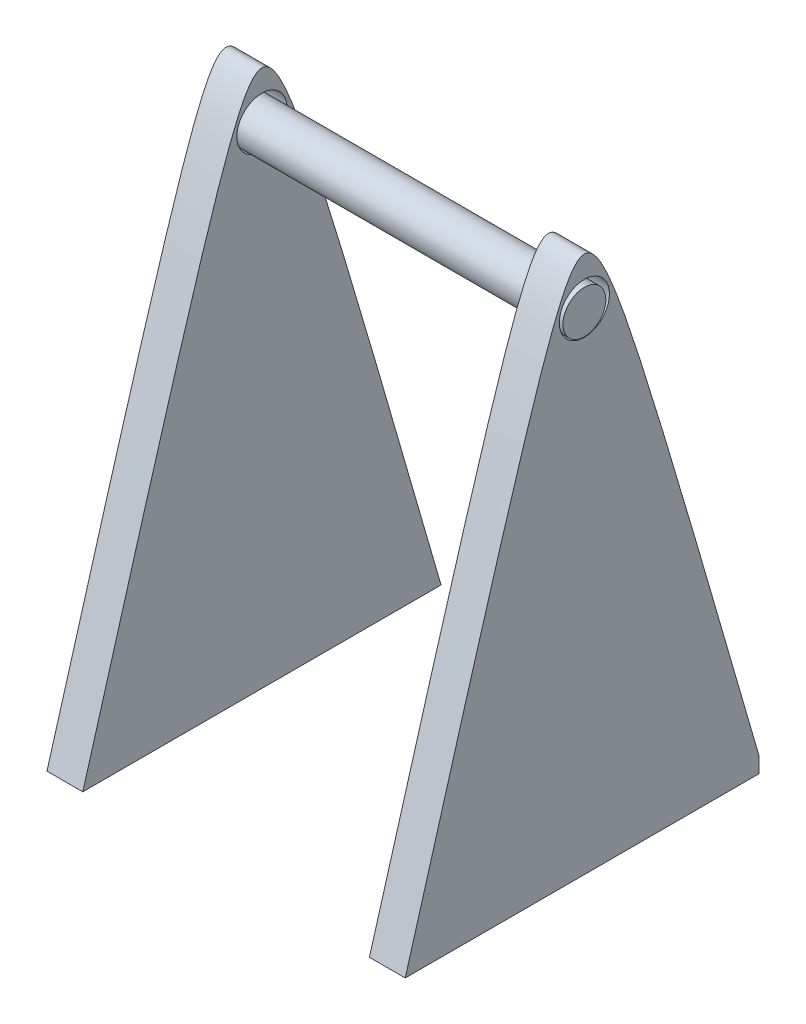
ISO-10303-21;
HEADER;
FILE_DESCRIPTION(('STEP AP214'),'2;1');
FILE_NAME('part.step','',(''),(''),'','','');
FILE_SCHEMA(('AUTOMOTIVE_DESIGN { 1 0 10303 214 1 1 1 1 }'));
ENDSEC;
DATA;
#1=APPLICATION_CONTEXT('core data for automotive mechanical design processes');
#2=APPLICATION_PROTOCOL_DEFINITION('international standard','automotive_design',2000,#1);
#3=PRODUCT_CONTEXT('',#1,'mechanical');
#4=PRODUCT('Part','Part','',(#3));
#5=PRODUCT_RELATED_PRODUCT_CATEGORY('part','',(#4));
#6=PRODUCT_DEFINITION_FORMATION('','',#4);
#7=PRODUCT_DEFINITION_CONTEXT('part definition',#1,'design');
#8=PRODUCT_DEFINITION('design','',#6,#7);
#9=PRODUCT_DEFINITION_SHAPE('','',#8);
#10=(LENGTH_UNIT() NAMED_UNIT(*) SI_UNIT(.MILLI.,.METRE.));
#11=(NAMED_UNIT(*) PLANE_ANGLE_UNIT() SI_UNIT($,.RADIAN.));
#12=(NAMED_UNIT(*) SI_UNIT($,.STERADIAN.) SOLID_ANGLE_UNIT());
#13=UNCERTAINTY_MEASURE_WITH_UNIT(LENGTH_MEASURE(1.E-05),#10,'distance_accuracy_value','');
#14=(GEOMETRIC_REPRESENTATION_CONTEXT(3) GLOBAL_UNCERTAINTY_ASSIGNED_CONTEXT((#13)) GLOBAL_UNIT_ASSIGNED_CONTEXT((#10,
#11,#12)) REPRESENTATION_CONTEXT('',''));
#15=CARTESIAN_POINT('',(0.,0.,0.));
#16=DIRECTION('',(0.,0.,1.));
#17=DIRECTION('',(1.,0.,0.));
#18=AXIS2_PLACEMENT_3D('',#15,#16,#17);
#19=CARTESIAN_POINT('',(-1286.24708052431,135.992086984383,-20.7594628975972));
#20=DIRECTION('',(-1.,0.,0.));
#21=DIRECTION('',(0.,0.,1.));
#22=AXIS2_PLACEMENT_3D('',#19,#20,#21);
#23=CYLINDRICAL_SURFACE('',#22,5.98376235501393);
#24=CARTESIAN_POINT('',(-1286.24708052431,135.992086984383,-20.7594628975972));
#25=DIRECTION('',(-1.,0.,0.));
#26=DIRECTION('',(0.,0.,1.));
#27=AXIS2_PLACEMENT_3D('',#24,#25,#26);
#28=CIRCLE('',#27,5.98376235501393);
#29=CARTESIAN_POINT('',(-1286.24708052431,135.992086984383,-14.7757005425833));
#30=VERTEX_POINT('',#29);
#31=EDGE_CURVE('E11',#30,#30,#28,.T.);
#32=ORIENTED_EDGE('',*,*,#31,.T.);
#33=EDGE_LOOP('',(#32));
#34=FACE_BOUND('',#33,.T.);
#35=CARTESIAN_POINT('',(-1386.24708052431,135.992086984383,-20.7594628975972));
#36=DIRECTION('',(-1.,0.,0.));
#37=DIRECTION('',(0.,0.,1.));
#38=AXIS2_PLACEMENT_3D('',#35,#36,#37);
#39=CIRCLE('',#38,5.98376235501393);
#40=CARTESIAN_POINT('',(-1386.24708052431,135.992086984383,-14.7757005425833));
#41=VERTEX_POINT('',#40);
#42=EDGE_CURVE('E44',#41,#41,#39,.T.);
#43=ORIENTED_EDGE('',*,*,#42,.F.);
#44=EDGE_LOOP('',(#43));
#45=FACE_BOUND('',#44,.T.);
#46=ADVANCED_FACE('F41',(#34,#45),#23,.T.);
#47=CARTESIAN_POINT('',(-1286.24708052431,135.992086984383,-20.7594628975972));
#48=DIRECTION('',(-1.,0.,0.));
#49=DIRECTION('',(0.,0.,1.));
#50=AXIS2_PLACEMENT_3D('',#47,#48,#49);
#51=PLANE('',#50);
#52=ORIENTED_EDGE('',*,*,#31,.F.);
#53=EDGE_LOOP('',(#52));
#54=FACE_BOUND('',#53,.T.);
#55=ADVANCED_FACE('F56',(#54),#51,.F.);
#56=CARTESIAN_POINT('',(-1386.24708052431,135.992086984383,-20.7594628975972));
#57=DIRECTION('',(-1.,0.,0.));
#58=DIRECTION('',(0.,0.,1.));
#59=AXIS2_PLACEMENT_3D('',#56,#57,#58);
#60=PLANE('',#59);
#61=ORIENTED_EDGE('',*,*,#42,.T.);
#62=EDGE_LOOP('',(#61));
#63=FACE_BOUND('',#62,.T.);
#64=ADVANCED_FACE('F53',(#63),#60,.T.);
#65=CLOSED_SHELL('',(#46,#55,#64));
#66=MANIFOLD_SOLID_BREP('B2',#65);
#67=CARTESIAN_POINT('',(-1769.70016923585,0.,-70.7594628975371));
#68=CARTESIAN_POINT('',(-1769.70016923585,173.888898661798,-20.7594628975372));
#69=CARTESIAN_POINT('',(-1769.70016923585,0.,29.2405371024629));
#70=(BOUNDED_CURVE() B_SPLINE_CURVE(2,(#67,#68,#69),.UNSPECIFIED.,.F.,
.F.) B_SPLINE_CURVE_WITH_KNOTS((3,3),(0.,1.),
.UNSPECIFIED.) CURVE() GEOMETRIC_REPRESENTATION_ITEM() RATIONAL_B_SPLINE_CURVE((1.,
6.27906719868464,1.)) REPRESENTATION_ITEM(''));
#71=DIRECTION('',(1.,0.,0.));
#72=VECTOR('',#71,1.);
#73=SURFACE_OF_LINEAR_EXTRUSION('',#70,#72);
#74=DIRECTION('',(1.,0.,0.));
#75=VECTOR('',#74,1.);
#76=CARTESIAN_POINT('',(-1769.70016923585,0.,29.2405371024629));
#77=LINE('',#76,#75);
#78=CARTESIAN_POINT('',(-1296.24708052431,0.,29.2405371024629));
#79=VERTEX_POINT('',#78);
#80=CARTESIAN_POINT('',(-1286.24708052431,0.,29.2405371024629));
#81=VERTEX_POINT('',#80);
#82=EDGE_CURVE('E39',#79,#81,#77,.T.);
#83=ORIENTED_EDGE('',*,*,#82,.T.);
#84=CARTESIAN_POINT('',(-1286.24708052431,0.,-70.7594628975371));
#85=CARTESIAN_POINT('',(-1286.24708052431,173.888898661798,-20.7594628975372));
#86=CARTESIAN_POINT('',(-1286.24708052431,0.,29.2405371024629));
#87=(BOUNDED_CURVE() B_SPLINE_CURVE(2,(#84,#85,#86),.UNSPECIFIED.,.F.,
.F.) B_SPLINE_CURVE_WITH_KNOTS((3,3),(0.,1.),
.UNSPECIFIED.) CURVE() GEOMETRIC_REPRESENTATION_ITEM() RATIONAL_B_SPLINE_CURVE((1.,
6.27906719868464,1.)) REPRESENTATION_ITEM(''));
#88=CARTESIAN_POINT('',(-1286.24708052431,4.33133944762662,-69.5136264334978));
#89=VERTEX_POINT('',#88);
#90=EDGE_CURVE('E105',#81,#89,#87,.F.);
#91=ORIENTED_EDGE('',*,*,#90,.T.);
#92=DIRECTION('',(1.,0.,0.));
#93=VECTOR('',#92,1.);
#94=CARTESIAN_POINT('',(-1769.70016923585,4.33133944762662,-69.5136264334978));
#95=LINE('',#94,#93);
#96=CARTESIAN_POINT('',(-1296.24708052431,4.33133944762673,-69.5136264334978));
#97=VERTEX_POINT('',#96);
#98=EDGE_CURVE('E136',#89,#97,#95,.F.);
#99=ORIENTED_EDGE('',*,*,#98,.T.);
#100=CARTESIAN_POINT('',(-1296.24708052431,0.,-70.7594628975371));
#101=CARTESIAN_POINT('',(-1296.24708052431,173.888898661798,-20.7594628975372));
#102=CARTESIAN_POINT('',(-1296.24708052431,0.,29.2405371024629));
#103=(BOUNDED_CURVE() B_SPLINE_CURVE(2,(#100,#101,#102),.UNSPECIFIED.,.F.,
.F.) B_SPLINE_CURVE_WITH_KNOTS((3,3),(0.,1.),
.UNSPECIFIED.) CURVE() GEOMETRIC_REPRESENTATION_ITEM() RATIONAL_B_SPLINE_CURVE((1.,
6.27906719868464,1.)) REPRESENTATION_ITEM(''));
#104=EDGE_CURVE('E113',#97,#79,#103,.T.);
#105=ORIENTED_EDGE('',*,*,#104,.T.);
#106=EDGE_LOOP('',(#83,#91,#99,#105));
#107=FACE_BOUND('',#106,.T.);
#108=ADVANCED_FACE('F90',(#107),#73,.T.);
#109=CARTESIAN_POINT('',(-1286.24708052431,150.,-69.5136264334978));
#110=DIRECTION('',(-1.,0.,0.));
#111=DIRECTION('',(0.,0.,1.));
#112=AXIS2_PLACEMENT_3D('',#109,#110,#111);
#113=PLANE('',#112);
#114=CARTESIAN_POINT('',(-1286.24708052431,136.874782273766,-20.7594628975972));
#115=DIRECTION('',(-1.,0.,0.));
#116=DIRECTION('',(0.,0.,1.));
#117=AXIS2_PLACEMENT_3D('',#114,#115,#116);
#118=CIRCLE('',#117,7.00000000000001);
#119=CARTESIAN_POINT('',(-1286.24708052431,136.874782273766,-13.7594628975972));
#120=VERTEX_POINT('',#119);
#121=EDGE_CURVE('E141',#120,#120,#118,.T.);
#122=ORIENTED_EDGE('',*,*,#121,.T.);
#123=EDGE_LOOP('',(#122));
#124=FACE_BOUND('',#123,.T.);
#125=ORIENTED_EDGE('',*,*,#90,.F.);
#126=DIRECTION('',(0.,0.,-1.));
#127=VECTOR('',#126,1.);
#128=CARTESIAN_POINT('',(-1286.24708052431,0.,-69.5136264334978));
#129=LINE('',#128,#127);
#130=CARTESIAN_POINT('',(-1286.24708052431,0.,-69.5136264334978));
#131=VERTEX_POINT('',#130);
#132=EDGE_CURVE('E128',#81,#131,#129,.T.);
#133=ORIENTED_EDGE('',*,*,#132,.T.);
#134=DIRECTION('',(0.,-1.,0.));
#135=VECTOR('',#134,1.);
#136=CARTESIAN_POINT('',(-1286.24708052431,150.,-69.5136264334978));
#137=LINE('',#136,#135);
#138=EDGE_CURVE('E99',#89,#131,#137,.T.);
#139=ORIENTED_EDGE('',*,*,#138,.F.);
#140=EDGE_LOOP('',(#125,#133,#139));
#141=FACE_BOUND('',#140,.T.);
#142=ADVANCED_FACE('F92',(#124,#141),#113,.F.);
#143=CARTESIAN_POINT('',(-1296.24708052431,150.,-69.5136264334978));
#144=DIRECTION('',(0.,0.,1.));
#145=DIRECTION('',(1.,0.,0.));
#146=AXIS2_PLACEMENT_3D('',#143,#144,#145);
#147=PLANE('',#146);
#148=ORIENTED_EDGE('',*,*,#98,.F.);
#149=ORIENTED_EDGE('',*,*,#138,.T.);
#150=DIRECTION('',(-1.,0.,0.));
#151=VECTOR('',#150,1.);
#152=CARTESIAN_POINT('',(-1296.24708052431,0.,-69.5136264334978));
#153=LINE('',#152,#151);
#154=CARTESIAN_POINT('',(-1296.24708052431,0.,-69.5136264334978));
#155=VERTEX_POINT('',#154);
#156=EDGE_CURVE('E132',#131,#155,#153,.T.);
#157=ORIENTED_EDGE('',*,*,#156,.T.);
#158=DIRECTION('',(0.,-1.,0.));
#159=VECTOR('',#158,1.);
#160=CARTESIAN_POINT('',(-1296.24708052431,150.,-69.5136264334978));
#161=LINE('',#160,#159);
#162=EDGE_CURVE('E161',#97,#155,#161,.T.);
#163=ORIENTED_EDGE('',*,*,#162,.F.);
#164=EDGE_LOOP('',(#148,#149,#157,#163));
#165=FACE_BOUND('',#164,.T.);
#166=ADVANCED_FACE('F164',(#165),#147,.F.);
#167=CARTESIAN_POINT('',(-1296.24708052431,150.,-69.5136264334978));
#168=DIRECTION('',(1.,0.,0.));
#169=DIRECTION('',(0.,0.,-1.));
#170=AXIS2_PLACEMENT_3D('',#167,#168,#169);
#171=PLANE('',#170);
#172=CARTESIAN_POINT('',(-1296.24708052431,136.874782273766,-20.7594628975972));
#173=DIRECTION('',(1.,0.,0.));
#174=DIRECTION('',(0.,0.,-1.));
#175=AXIS2_PLACEMENT_3D('',#172,#173,#174);
#176=CIRCLE('',#175,7.00000000000001);
#177=CARTESIAN_POINT('',(-1296.24708052431,136.874782273766,-27.7594628975972));
#178=VERTEX_POINT('',#177);
#179=EDGE_CURVE('E94',#178,#178,#176,.T.);
#180=ORIENTED_EDGE('',*,*,#179,.T.);
#181=EDGE_LOOP('',(#180));
#182=FACE_BOUND('',#181,.T.);
#183=ORIENTED_EDGE('',*,*,#104,.F.);
#184=ORIENTED_EDGE('',*,*,#162,.T.);
#185=DIRECTION('',(0.,0.,1.));
#186=VECTOR('',#185,1.);
#187=CARTESIAN_POINT('',(-1296.24708052431,0.,-69.5136264334978));
#188=LINE('',#187,#186);
#189=EDGE_CURVE('E159',#155,#79,#188,.T.);
#190=ORIENTED_EDGE('',*,*,#189,.T.);
#191=EDGE_LOOP('',(#183,#184,#190));
#192=FACE_BOUND('',#191,.T.);
#193=ADVANCED_FACE('F165',(#182,#192),#171,.F.);
#194=CARTESIAN_POINT('',(0.,0.,0.));
#195=DIRECTION('',(0.,1.,0.));
#196=DIRECTION('',(0.,0.,1.));
#197=AXIS2_PLACEMENT_3D('',#194,#195,#196);
#198=PLANE('',#197);
#199=ORIENTED_EDGE('',*,*,#82,.F.);
#200=ORIENTED_EDGE('',*,*,#189,.F.);
#201=ORIENTED_EDGE('',*,*,#156,.F.);
#202=ORIENTED_EDGE('',*,*,#132,.F.);
#203=EDGE_LOOP('',(#199,#200,#201,#202));
#204=FACE_BOUND('',#203,.T.);
#205=ADVANCED_FACE('F129',(#204),#198,.F.);
#206=CARTESIAN_POINT('',(-1286.24708052431,136.874782273766,-20.7594628975972));
#207=DIRECTION('',(-1.,0.,0.));
#208=DIRECTION('',(0.,0.,1.));
#209=AXIS2_PLACEMENT_3D('',#206,#207,#208);
#210=CYLINDRICAL_SURFACE('',#209,7.00000000000001);
#211=ORIENTED_EDGE('',*,*,#121,.F.);
#212=EDGE_LOOP('',(#211));
#213=FACE_BOUND('',#212,.T.);
#214=ORIENTED_EDGE('',*,*,#179,.F.);
#215=EDGE_LOOP('',(#214));
#216=FACE_BOUND('',#215,.T.);
#217=ADVANCED_FACE('F173',(#213,#216),#210,.F.);
#218=CLOSED_SHELL('',(#108,#142,#166,#193,#205,#217));
#219=MANIFOLD_SOLID_BREP('B6',#218);
#220=CARTESIAN_POINT('',(-1769.70016923585,0.,-70.7594628975371));
#221=CARTESIAN_POINT('',(-1769.70016923585,173.888898661798,-20.7594628975372));
#222=CARTESIAN_POINT('',(-1769.70016923585,0.,29.2405371024629));
#223=(BOUNDED_CURVE() B_SPLINE_CURVE(2,(#220,#221,#222),.UNSPECIFIED.,.F.,
.F.) B_SPLINE_CURVE_WITH_KNOTS((3,3),(0.,1.),
.UNSPECIFIED.) CURVE() GEOMETRIC_REPRESENTATION_ITEM() RATIONAL_B_SPLINE_CURVE((1.,
6.27906719868464,1.)) REPRESENTATION_ITEM(''));
#224=DIRECTION('',(1.,0.,0.));
#225=VECTOR('',#224,1.);
#226=SURFACE_OF_LINEAR_EXTRUSION('',#223,#225);
#227=DIRECTION('',(1.,0.,0.));
#228=VECTOR('',#227,1.);
#229=CARTESIAN_POINT('',(-1386.24708052431,0.,29.2405371024629));
#230=LINE('',#229,#228);
#231=CARTESIAN_POINT('',(-1386.24708052431,0.,29.2405371024629));
#232=VERTEX_POINT('',#231);
#233=CARTESIAN_POINT('',(-1376.24708052431,0.,29.2405371024629));
#234=VERTEX_POINT('',#233);
#235=EDGE_CURVE('E88',#232,#234,#230,.T.);
#236=ORIENTED_EDGE('',*,*,#235,.T.);
#237=CARTESIAN_POINT('',(-1376.24708052431,0.,-70.7594628975371));
#238=CARTESIAN_POINT('',(-1376.24708052431,173.888898661798,-20.7594628975372));
#239=CARTESIAN_POINT('',(-1376.24708052431,0.,29.2405371024629));
#240=(BOUNDED_CURVE() B_SPLINE_CURVE(2,(#237,#238,#239),.UNSPECIFIED.,.F.,
.F.) B_SPLINE_CURVE_WITH_KNOTS((3,3),(0.,1.),
.UNSPECIFIED.) CURVE() GEOMETRIC_REPRESENTATION_ITEM() RATIONAL_B_SPLINE_CURVE((1.,
6.27906719868464,1.)) REPRESENTATION_ITEM(''));
#241=CARTESIAN_POINT('',(-1376.24708052431,0.,-70.7594628975371));
#242=VERTEX_POINT('',#241);
#243=EDGE_CURVE('E257',#234,#242,#240,.F.);
#244=ORIENTED_EDGE('',*,*,#243,.T.);
#245=DIRECTION('',(-1.,0.,0.));
#246=VECTOR('',#245,1.);
#247=CARTESIAN_POINT('',(-1386.24708052431,0.,-70.7594628975371));
#248=LINE('',#247,#246);
#249=CARTESIAN_POINT('',(-1386.24708052431,0.,-70.7594628975371));
#250=VERTEX_POINT('',#249);
#251=EDGE_CURVE('E255',#242,#250,#248,.T.);
#252=ORIENTED_EDGE('',*,*,#251,.T.);
#253=CARTESIAN_POINT('',(-1386.24708052431,0.,-70.7594628975371));
#254=CARTESIAN_POINT('',(-1386.24708052431,173.888898661798,-20.7594628975372));
#255=CARTESIAN_POINT('',(-1386.24708052431,0.,29.2405371024629));
#256=(BOUNDED_CURVE() B_SPLINE_CURVE(2,(#253,#254,#255),.UNSPECIFIED.,.F.,
.F.) B_SPLINE_CURVE_WITH_KNOTS((3,3),(0.,1.),
.UNSPECIFIED.) CURVE() GEOMETRIC_REPRESENTATION_ITEM() RATIONAL_B_SPLINE_CURVE((1.,
6.27906719868464,1.)) REPRESENTATION_ITEM(''));
#257=EDGE_CURVE('E242',#250,#232,#256,.T.);
#258=ORIENTED_EDGE('',*,*,#257,.T.);
#259=EDGE_LOOP('',(#236,#244,#252,#258));
#260=FACE_BOUND('',#259,.T.);
#261=ADVANCED_FACE('F225',(#260),#226,.T.);
#262=CARTESIAN_POINT('',(-1376.24708052431,150.,-70.7594628975371));
#263=DIRECTION('',(-1.,0.,0.));
#264=DIRECTION('',(0.,0.,1.));
#265=AXIS2_PLACEMENT_3D('',#262,#263,#264);
#266=PLANE('',#265);
#267=CARTESIAN_POINT('',(-1376.24708052431,136.874782273766,-20.7594628975972));
#268=DIRECTION('',(-1.,0.,0.));
#269=DIRECTION('',(0.,0.,1.));
#270=AXIS2_PLACEMENT_3D('',#267,#268,#269);
#271=CIRCLE('',#270,7.00000000000001);
#272=CARTESIAN_POINT('',(-1376.24708052431,136.874782273766,-13.7594628975972));
#273=VERTEX_POINT('',#272);
#274=EDGE_CURVE('E261',#273,#273,#271,.T.);
#275=ORIENTED_EDGE('',*,*,#274,.T.);
#276=EDGE_LOOP('',(#275));
#277=FACE_BOUND('',#276,.T.);
#278=ORIENTED_EDGE('',*,*,#243,.F.);
#279=DIRECTION('',(0.,0.,-1.));
#280=VECTOR('',#279,1.);
#281=CARTESIAN_POINT('',(-1376.24708052431,0.,-70.7594628975371));
#282=LINE('',#281,#280);
#283=EDGE_CURVE('E251',#234,#242,#282,.T.);
#284=ORIENTED_EDGE('',*,*,#283,.T.);
#285=EDGE_LOOP('',(#278,#284));
#286=FACE_BOUND('',#285,.T.);
#287=ADVANCED_FACE('F227',(#277,#286),#266,.F.);
#288=CARTESIAN_POINT('',(-1386.24708052431,150.,-70.7594628975371));
#289=DIRECTION('',(1.,0.,0.));
#290=DIRECTION('',(0.,0.,-1.));
#291=AXIS2_PLACEMENT_3D('',#288,#289,#290);
#292=PLANE('',#291);
#293=CARTESIAN_POINT('',(-1386.24708052431,136.874782273766,-20.7594628975972));
#294=DIRECTION('',(-1.,0.,0.));
#295=DIRECTION('',(0.,0.,1.));
#296=AXIS2_PLACEMENT_3D('',#293,#294,#295);
#297=CIRCLE('',#296,7.00000000000001);
#298=CARTESIAN_POINT('',(-1386.24708052431,136.874782273766,-13.7594628975972));
#299=VERTEX_POINT('',#298);
#300=EDGE_CURVE('E264',#299,#299,#297,.T.);
#301=ORIENTED_EDGE('',*,*,#300,.F.);
#302=EDGE_LOOP('',(#301));
#303=FACE_BOUND('',#302,.T.);
#304=ORIENTED_EDGE('',*,*,#257,.F.);
#305=DIRECTION('',(0.,0.,1.));
#306=VECTOR('',#305,1.);
#307=CARTESIAN_POINT('',(-1386.24708052431,0.,-70.7594628975371));
#308=LINE('',#307,#306);
#309=EDGE_CURVE('E233',#250,#232,#308,.T.);
#310=ORIENTED_EDGE('',*,*,#309,.T.);
#311=EDGE_LOOP('',(#304,#310));
#312=FACE_BOUND('',#311,.T.);
#313=ADVANCED_FACE('F291',(#303,#312),#292,.F.);
#314=CARTESIAN_POINT('',(0.,0.,0.));
#315=DIRECTION('',(0.,1.,0.));
#316=DIRECTION('',(0.,0.,1.));
#317=AXIS2_PLACEMENT_3D('',#314,#315,#316);
#318=PLANE('',#317);
#319=ORIENTED_EDGE('',*,*,#283,.F.);
#320=ORIENTED_EDGE('',*,*,#235,.F.);
#321=ORIENTED_EDGE('',*,*,#309,.F.);
#322=ORIENTED_EDGE('',*,*,#251,.F.);
#323=EDGE_LOOP('',(#319,#320,#321,#322));
#324=FACE_BOUND('',#323,.T.);
#325=ADVANCED_FACE('F253',(#324),#318,.F.);
#326=CARTESIAN_POINT('',(-1286.24708052431,136.874782273766,-20.7594628975972));
#327=DIRECTION('',(-1.,0.,0.));
#328=DIRECTION('',(0.,0.,1.));
#329=AXIS2_PLACEMENT_3D('',#326,#327,#328);
#330=CYLINDRICAL_SURFACE('',#329,7.00000000000001);
#331=ORIENTED_EDGE('',*,*,#300,.T.);
#332=EDGE_LOOP('',(#331));
#333=FACE_BOUND('',#332,.T.);
#334=ORIENTED_EDGE('',*,*,#274,.F.);
#335=EDGE_LOOP('',(#334));
#336=FACE_BOUND('',#335,.T.);
#337=ADVANCED_FACE('F289',(#333,#336),#330,.F.);
#338=CLOSED_SHELL('',(#261,#287,#313,#325,#337));
#339=MANIFOLD_SOLID_BREP('B33',#338);
#340=ADVANCED_BREP_SHAPE_REPRESENTATION('',(#18,#66,#219,#339),#14);
#341=SHAPE_DEFINITION_REPRESENTATION(#9,#340);
ENDSEC;
END-ISO-10303-21;
